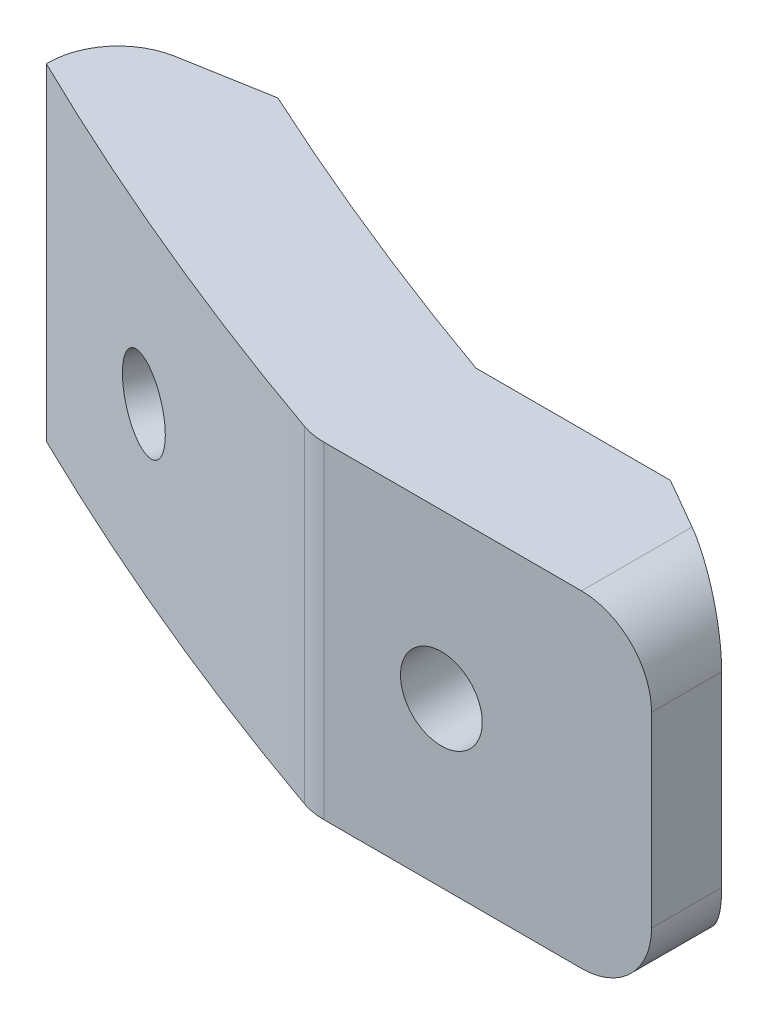
ISO-10303-21;
HEADER;
FILE_DESCRIPTION(('STEP AP214'),'2;1');
FILE_NAME('part.step','',(''),(''),'','','');
FILE_SCHEMA(('AUTOMOTIVE_DESIGN { 1 0 10303 214 1 1 1 1 }'));
ENDSEC;
DATA;
#1=APPLICATION_CONTEXT('core data for automotive mechanical design processes');
#2=APPLICATION_PROTOCOL_DEFINITION('international standard','automotive_design',2000,#1);
#3=PRODUCT_CONTEXT('',#1,'mechanical');
#4=PRODUCT('Part','Part','',(#3));
#5=PRODUCT_RELATED_PRODUCT_CATEGORY('part','',(#4));
#6=PRODUCT_DEFINITION_FORMATION('','',#4);
#7=PRODUCT_DEFINITION_CONTEXT('part definition',#1,'design');
#8=PRODUCT_DEFINITION('design','',#6,#7);
#9=PRODUCT_DEFINITION_SHAPE('','',#8);
#10=(LENGTH_UNIT() NAMED_UNIT(*) SI_UNIT(.MILLI.,.METRE.));
#11=(NAMED_UNIT(*) PLANE_ANGLE_UNIT() SI_UNIT($,.RADIAN.));
#12=(NAMED_UNIT(*) SI_UNIT($,.STERADIAN.) SOLID_ANGLE_UNIT());
#13=UNCERTAINTY_MEASURE_WITH_UNIT(LENGTH_MEASURE(1.E-05),#10,'distance_accuracy_value','');
#14=(GEOMETRIC_REPRESENTATION_CONTEXT(3) GLOBAL_UNCERTAINTY_ASSIGNED_CONTEXT((#13)) GLOBAL_UNIT_ASSIGNED_CONTEXT((#10,
#11,#12)) REPRESENTATION_CONTEXT('',''));
#15=CARTESIAN_POINT('',(0.,0.,0.));
#16=DIRECTION('',(0.,0.,1.));
#17=DIRECTION('',(1.,0.,0.));
#18=AXIS2_PLACEMENT_3D('',#15,#16,#17);
#19=CARTESIAN_POINT('',(-25.,7.,33.5));
#20=DIRECTION('',(1.,0.,0.));
#21=DIRECTION('',(0.,0.,-1.));
#22=AXIS2_PLACEMENT_3D('',#19,#20,#21);
#23=PLANE('',#22);
#24=DIRECTION('',(0.,0.,1.));
#25=VECTOR('',#24,1.);
#26=CARTESIAN_POINT('',(-25.,7.,33.5));
#27=LINE('',#26,#25);
#28=CARTESIAN_POINT('',(-25.,7.,25.3385305848672));
#29=VERTEX_POINT('',#28);
#30=CARTESIAN_POINT('',(-25.,7.,25.4123547212383));
#31=VERTEX_POINT('',#30);
#32=EDGE_CURVE('E441',#29,#31,#27,.T.);
#33=ORIENTED_EDGE('',*,*,#32,.F.);
#34=DIRECTION('',(0.,-1.,0.));
#35=VECTOR('',#34,1.);
#36=CARTESIAN_POINT('',(-25.,7.,25.3385305848672));
#37=LINE('',#36,#35);
#38=CARTESIAN_POINT('',(-25.,-7.,25.3385305848672));
#39=VERTEX_POINT('',#38);
#40=EDGE_CURVE('E461',#29,#39,#37,.T.);
#41=ORIENTED_EDGE('',*,*,#40,.T.);
#42=DIRECTION('',(0.,0.,1.));
#43=VECTOR('',#42,1.);
#44=CARTESIAN_POINT('',(-25.,-7.,33.5));
#45=LINE('',#44,#43);
#46=CARTESIAN_POINT('',(-25.,-7.,25.4123547212383));
#47=VERTEX_POINT('',#46);
#48=EDGE_CURVE('E449',#39,#47,#45,.T.);
#49=ORIENTED_EDGE('',*,*,#48,.T.);
#50=DIRECTION('',(0.,1.,0.));
#51=VECTOR('',#50,1.);
#52=CARTESIAN_POINT('',(-25.,-7.,25.4123547212383));
#53=LINE('',#52,#51);
#54=EDGE_CURVE('E426',#31,#47,#53,.F.);
#55=ORIENTED_EDGE('',*,*,#54,.F.);
#56=EDGE_LOOP('',(#33,#41,#49,#55));
#57=FACE_BOUND('',#56,.T.);
#58=ADVANCED_FACE('F38',(#57),#23,.F.);
#59=CARTESIAN_POINT('',(9.,7.,33.5));
#60=DIRECTION('',(0.,0.,-1.));
#61=DIRECTION('',(-1.,0.,0.));
#62=AXIS2_PLACEMENT_3D('',#59,#60,#61);
#63=PLANE('',#62);
#64=CARTESIAN_POINT('',(0.,0.,33.5));
#65=DIRECTION('',(0.,0.,1.));
#66=DIRECTION('',(1.,0.,0.));
#67=AXIS2_PLACEMENT_3D('',#64,#65,#66);
#68=CIRCLE('',#67,1.75);
#69=CARTESIAN_POINT('',(1.75,0.,33.5));
#70=VERTEX_POINT('',#69);
#71=EDGE_CURVE('E435',#70,#70,#68,.T.);
#72=ORIENTED_EDGE('',*,*,#71,.F.);
#73=EDGE_LOOP('',(#72));
#74=FACE_BOUND('',#73,.T.);
#75=DIRECTION('',(1.,0.,0.));
#76=VECTOR('',#75,1.);
#77=CARTESIAN_POINT('',(9.,-7.,33.5));
#78=LINE('',#77,#76);
#79=CARTESIAN_POINT('',(-5.03347213942744,-7.,33.5));
#80=VERTEX_POINT('',#79);
#81=CARTESIAN_POINT('',(6.,-7.,33.5));
#82=VERTEX_POINT('',#81);
#83=EDGE_CURVE('E451',#80,#82,#78,.T.);
#84=ORIENTED_EDGE('',*,*,#83,.T.);
#85=CARTESIAN_POINT('',(6.,-4.,33.5));
#86=DIRECTION('',(0.,0.,-1.));
#87=DIRECTION('',(-1.,0.,0.));
#88=AXIS2_PLACEMENT_3D('',#85,#86,#87);
#89=CIRCLE('',#88,3.);
#90=CARTESIAN_POINT('',(9.,-4.,33.5));
#91=VERTEX_POINT('',#90);
#92=EDGE_CURVE('E363',#82,#91,#89,.F.);
#93=ORIENTED_EDGE('',*,*,#92,.T.);
#94=DIRECTION('',(0.,-1.,0.));
#95=VECTOR('',#94,1.);
#96=CARTESIAN_POINT('',(9.,7.,33.5));
#97=LINE('',#96,#95);
#98=CARTESIAN_POINT('',(9.,4.,33.5));
#99=VERTEX_POINT('',#98);
#100=EDGE_CURVE('E458',#99,#91,#97,.T.);
#101=ORIENTED_EDGE('',*,*,#100,.F.);
#102=CARTESIAN_POINT('',(6.,4.,33.5));
#103=DIRECTION('',(0.,0.,-1.));
#104=DIRECTION('',(-1.,0.,0.));
#105=AXIS2_PLACEMENT_3D('',#102,#103,#104);
#106=CIRCLE('',#105,3.);
#107=CARTESIAN_POINT('',(6.,7.,33.5));
#108=VERTEX_POINT('',#107);
#109=EDGE_CURVE('E356',#99,#108,#106,.F.);
#110=ORIENTED_EDGE('',*,*,#109,.T.);
#111=DIRECTION('',(1.,0.,0.));
#112=VECTOR('',#111,1.);
#113=CARTESIAN_POINT('',(9.,7.,33.5));
#114=LINE('',#113,#112);
#115=CARTESIAN_POINT('',(-5.03347213942744,7.,33.5));
#116=VERTEX_POINT('',#115);
#117=EDGE_CURVE('E444',#116,#108,#114,.T.);
#118=ORIENTED_EDGE('',*,*,#117,.F.);
#119=DIRECTION('',(0.,-1.,0.));
#120=VECTOR('',#119,1.);
#121=CARTESIAN_POINT('',(-5.03347213942744,-7.,33.5));
#122=LINE('',#121,#120);
#123=EDGE_CURVE('E364',#116,#80,#122,.T.);
#124=ORIENTED_EDGE('',*,*,#123,.T.);
#125=EDGE_LOOP('',(#84,#93,#101,#110,#118,#124));
#126=FACE_BOUND('',#125,.T.);
#127=ADVANCED_FACE('F324',(#74,#126),#63,.F.);
#128=CARTESIAN_POINT('',(0.,7.,0.));
#129=DIRECTION('',(0.,1.,0.));
#130=DIRECTION('',(0.,0.,1.));
#131=AXIS2_PLACEMENT_3D('',#128,#129,#130);
#132=PLANE('',#131);
#133=CARTESIAN_POINT('',(51.,7.,-130.));
#134=DIRECTION('',(0.,1.,0.));
#135=DIRECTION('',(0.,0.,1.));
#136=AXIS2_PLACEMENT_3D('',#133,#134,#135);
#137=CIRCLE('',#136,167.);
#138=CARTESIAN_POINT('',(-18.7770704656511,7.,21.7239613153821));
#139=VERTEX_POINT('',#138);
#140=CARTESIAN_POINT('',(-4.52251795442995,7.,27.5));
#141=VERTEX_POINT('',#140);
#142=EDGE_CURVE('E219',#139,#141,#137,.T.);
#143=ORIENTED_EDGE('',*,*,#142,.F.);
#144=DIRECTION('',(-0.984807753012209,0.,0.173648177666924));
#145=VECTOR('',#144,1.);
#146=CARTESIAN_POINT('',(-25.,7.,22.8212316913353));
#147=LINE('',#146,#145);
#148=CARTESIAN_POINT('',(-22.5209445330008,7.,22.3841073258306));
#149=VERTEX_POINT('',#148);
#150=EDGE_CURVE('E439',#139,#149,#147,.T.);
#151=ORIENTED_EDGE('',*,*,#150,.T.);
#152=CARTESIAN_POINT('',(-22.,7.,25.3385305848672));
#153=DIRECTION('',(0.,1.,0.));
#154=DIRECTION('',(0.,0.,1.));
#155=AXIS2_PLACEMENT_3D('',#152,#153,#154);
#156=CIRCLE('',#155,3.);
#157=EDGE_CURVE('E477',#149,#29,#156,.T.);
#158=ORIENTED_EDGE('',*,*,#157,.T.);
#159=ORIENTED_EDGE('',*,*,#32,.T.);
#160=CARTESIAN_POINT('',(51.,7.,-130.));
#161=DIRECTION('',(0.,1.,0.));
#162=DIRECTION('',(0.,0.,1.));
#163=AXIS2_PLACEMENT_3D('',#160,#161,#162);
#164=CIRCLE('',#163,173.);
#165=CARTESIAN_POINT('',(-6.02229811835852,7.,33.3323529411765));
#166=VERTEX_POINT('',#165);
#167=EDGE_CURVE('E427',#31,#166,#164,.T.);
#168=ORIENTED_EDGE('',*,*,#167,.T.);
#169=CARTESIAN_POINT('',(-5.03347213942744,7.,30.5));
#170=DIRECTION('',(0.,1.,0.));
#171=DIRECTION('',(0.,0.,1.));
#172=AXIS2_PLACEMENT_3D('',#169,#170,#171);
#173=CIRCLE('',#172,3.);
#174=EDGE_CURVE('E474',#166,#116,#173,.T.);
#175=ORIENTED_EDGE('',*,*,#174,.T.);
#176=ORIENTED_EDGE('',*,*,#117,.T.);
#177=DIRECTION('',(0.,0.,-1.));
#178=VECTOR('',#177,1.);
#179=CARTESIAN_POINT('',(6.,7.,30.5));
#180=LINE('',#179,#178);
#181=CARTESIAN_POINT('',(6.,7.,28.7679491924311));
#182=VERTEX_POINT('',#181);
#183=EDGE_CURVE('E358',#108,#182,#180,.T.);
#184=ORIENTED_EDGE('',*,*,#183,.T.);
#185=DIRECTION('',(-0.866025403784441,0.,-0.499999999999996));
#186=VECTOR('',#185,1.);
#187=CARTESIAN_POINT('',(9.,7.,30.5));
#188=LINE('',#187,#186);
#189=CARTESIAN_POINT('',(3.80384757729328,7.,27.5));
#190=VERTEX_POINT('',#189);
#191=EDGE_CURVE('E229',#182,#190,#188,.T.);
#192=ORIENTED_EDGE('',*,*,#191,.T.);
#193=DIRECTION('',(1.,0.,0.));
#194=VECTOR('',#193,1.);
#195=CARTESIAN_POINT('',(-4.52251795442995,7.,27.5));
#196=LINE('',#195,#194);
#197=EDGE_CURVE('E209',#141,#190,#196,.T.);
#198=ORIENTED_EDGE('',*,*,#197,.F.);
#199=EDGE_LOOP('',(#143,#151,#158,#159,#168,#175,#176,#184,#192,#198));
#200=FACE_BOUND('',#199,.T.);
#201=ADVANCED_FACE('F226',(#200),#132,.T.);
#202=CARTESIAN_POINT('',(0.,-7.,0.));
#203=DIRECTION('',(0.,1.,0.));
#204=DIRECTION('',(0.,0.,1.));
#205=AXIS2_PLACEMENT_3D('',#202,#203,#204);
#206=PLANE('',#205);
#207=DIRECTION('',(-0.984807753012209,0.,0.173648177666924));
#208=VECTOR('',#207,1.);
#209=CARTESIAN_POINT('',(-25.,-7.,22.8212316913353));
#210=LINE('',#209,#208);
#211=CARTESIAN_POINT('',(-18.7770704656511,-7.,21.7239613153821));
#212=VERTEX_POINT('',#211);
#213=CARTESIAN_POINT('',(-22.5209445330008,-7.,22.3841073258306));
#214=VERTEX_POINT('',#213);
#215=EDGE_CURVE('E438',#212,#214,#210,.T.);
#216=ORIENTED_EDGE('',*,*,#215,.F.);
#217=CARTESIAN_POINT('',(51.,-7.,-130.));
#218=DIRECTION('',(0.,1.,0.));
#219=DIRECTION('',(0.,0.,1.));
#220=AXIS2_PLACEMENT_3D('',#217,#218,#219);
#221=CIRCLE('',#220,167.);
#222=CARTESIAN_POINT('',(-4.52251795442995,-7.,27.5));
#223=VERTEX_POINT('',#222);
#224=EDGE_CURVE('E752',#212,#223,#221,.T.);
#225=ORIENTED_EDGE('',*,*,#224,.T.);
#226=DIRECTION('',(1.,0.,0.));
#227=VECTOR('',#226,1.);
#228=CARTESIAN_POINT('',(0.,-7.,27.5));
#229=LINE('',#228,#227);
#230=CARTESIAN_POINT('',(3.8038475772933,-7.,27.5));
#231=VERTEX_POINT('',#230);
#232=EDGE_CURVE('E496',#223,#231,#229,.T.);
#233=ORIENTED_EDGE('',*,*,#232,.T.);
#234=DIRECTION('',(-0.866025403784441,0.,-0.499999999999996));
#235=VECTOR('',#234,1.);
#236=CARTESIAN_POINT('',(9.,-7.,30.5));
#237=LINE('',#236,#235);
#238=CARTESIAN_POINT('',(6.,-7.,28.7679491924311));
#239=VERTEX_POINT('',#238);
#240=EDGE_CURVE('E442',#239,#231,#237,.T.);
#241=ORIENTED_EDGE('',*,*,#240,.F.);
#242=DIRECTION('',(0.,0.,-1.));
#243=VECTOR('',#242,1.);
#244=CARTESIAN_POINT('',(6.,-7.,0.));
#245=LINE('',#244,#243);
#246=EDGE_CURVE('E466',#239,#82,#245,.F.);
#247=ORIENTED_EDGE('',*,*,#246,.T.);
#248=ORIENTED_EDGE('',*,*,#83,.F.);
#249=CARTESIAN_POINT('',(-5.03347213942744,-7.,30.5));
#250=DIRECTION('',(0.,1.,0.));
#251=DIRECTION('',(0.,0.,1.));
#252=AXIS2_PLACEMENT_3D('',#249,#250,#251);
#253=CIRCLE('',#252,3.);
#254=CARTESIAN_POINT('',(-6.02229811835852,-7.,33.3323529411765));
#255=VERTEX_POINT('',#254);
#256=EDGE_CURVE('E464',#80,#255,#253,.F.);
#257=ORIENTED_EDGE('',*,*,#256,.T.);
#258=CARTESIAN_POINT('',(51.,-7.,-130.));
#259=DIRECTION('',(0.,1.,0.));
#260=DIRECTION('',(0.,0.,1.));
#261=AXIS2_PLACEMENT_3D('',#258,#259,#260);
#262=CIRCLE('',#261,173.);
#263=EDGE_CURVE('E423',#47,#255,#262,.T.);
#264=ORIENTED_EDGE('',*,*,#263,.F.);
#265=ORIENTED_EDGE('',*,*,#48,.F.);
#266=CARTESIAN_POINT('',(-22.,-7.,25.3385305848672));
#267=DIRECTION('',(0.,1.,0.));
#268=DIRECTION('',(0.,0.,1.));
#269=AXIS2_PLACEMENT_3D('',#266,#267,#268);
#270=CIRCLE('',#269,3.);
#271=EDGE_CURVE('E468',#39,#214,#270,.F.);
#272=ORIENTED_EDGE('',*,*,#271,.T.);
#273=EDGE_LOOP('',(#216,#225,#233,#241,#247,#248,#257,#264,#265,#272));
#274=FACE_BOUND('',#273,.T.);
#275=ADVANCED_FACE('F493',(#274),#206,.F.);
#276=CARTESIAN_POINT('',(9.,7.,30.5));
#277=DIRECTION('',(-0.499999999999996,0.,0.866025403784441));
#278=DIRECTION('',(0.866025403784441,0.,0.499999999999996));
#279=AXIS2_PLACEMENT_3D('',#276,#277,#278);
#280=PLANE('',#279);
#281=ORIENTED_EDGE('',*,*,#240,.T.);
#282=DIRECTION('',(0.,-1.,0.));
#283=VECTOR('',#282,1.);
#284=CARTESIAN_POINT('',(3.80384757729331,7.,27.5));
#285=LINE('',#284,#283);
#286=EDGE_CURVE('E433',#190,#231,#285,.T.);
#287=ORIENTED_EDGE('',*,*,#286,.F.);
#288=ORIENTED_EDGE('',*,*,#191,.F.);
#289=CARTESIAN_POINT('',(6.,4.,28.7679491924311));
#290=DIRECTION('',(-0.499999999999996,0.,0.866025403784441));
#291=DIRECTION('',(0.866025403784441,0.,0.499999999999996));
#292=AXIS2_PLACEMENT_3D('',#289,#290,#291);
#293=ELLIPSE('',#292,3.46410161513775,3.);
#294=CARTESIAN_POINT('',(9.,4.,30.5));
#295=VERTEX_POINT('',#294);
#296=EDGE_CURVE('E483',#182,#295,#293,.F.);
#297=ORIENTED_EDGE('',*,*,#296,.T.);
#298=DIRECTION('',(0.,-1.,0.));
#299=VECTOR('',#298,1.);
#300=CARTESIAN_POINT('',(9.,7.,30.5));
#301=LINE('',#300,#299);
#302=CARTESIAN_POINT('',(9.,-4.,30.5));
#303=VERTEX_POINT('',#302);
#304=EDGE_CURVE('E447',#295,#303,#301,.T.);
#305=ORIENTED_EDGE('',*,*,#304,.T.);
#306=CARTESIAN_POINT('',(6.,-4.,28.7679491924311));
#307=DIRECTION('',(-0.499999999999996,0.,0.866025403784441));
#308=DIRECTION('',(-0.866025403784441,0.,-0.499999999999996));
#309=AXIS2_PLACEMENT_3D('',#306,#307,#308);
#310=ELLIPSE('',#309,3.46410161513775,3.);
#311=EDGE_CURVE('E368',#303,#239,#310,.F.);
#312=ORIENTED_EDGE('',*,*,#311,.T.);
#313=EDGE_LOOP('',(#281,#287,#288,#297,#305,#312));
#314=FACE_BOUND('',#313,.T.);
#315=ADVANCED_FACE('F486',(#314),#280,.F.);
#316=CARTESIAN_POINT('',(0.,0.,-1.5));
#317=DIRECTION('',(0.,0.,1.));
#318=DIRECTION('',(1.,0.,0.));
#319=AXIS2_PLACEMENT_3D('',#316,#317,#318);
#320=CYLINDRICAL_SURFACE('',#319,1.75);
#321=CARTESIAN_POINT('',(0.,0.,30.5));
#322=DIRECTION('',(0.,0.,1.));
#323=DIRECTION('',(1.,0.,0.));
#324=AXIS2_PLACEMENT_3D('',#321,#322,#323);
#325=CIRCLE('',#324,1.75);
#326=CARTESIAN_POINT('',(1.75,0.,30.5));
#327=VERTEX_POINT('',#326);
#328=EDGE_CURVE('E307',#327,#327,#325,.F.);
#329=ORIENTED_EDGE('',*,*,#328,.T.);
#330=EDGE_LOOP('',(#329));
#331=FACE_BOUND('',#330,.T.);
#332=ORIENTED_EDGE('',*,*,#71,.T.);
#333=EDGE_LOOP('',(#332));
#334=FACE_BOUND('',#333,.T.);
#335=ADVANCED_FACE('F338',(#331,#334),#320,.F.);
#336=CARTESIAN_POINT('',(-25.,7.,22.8212316913353));
#337=DIRECTION('',(0.173648177666924,0.,0.984807753012209));
#338=DIRECTION('',(0.984807753012209,0.,-0.173648177666924));
#339=AXIS2_PLACEMENT_3D('',#336,#337,#338);
#340=PLANE('',#339);
#341=ORIENTED_EDGE('',*,*,#150,.F.);
#342=DIRECTION('',(0.,1.,0.));
#343=VECTOR('',#342,1.);
#344=CARTESIAN_POINT('',(-18.7770704656511,-7.30276141803491,21.7239613153821));
#345=LINE('',#344,#343);
#346=EDGE_CURVE('E222',#139,#212,#345,.F.);
#347=ORIENTED_EDGE('',*,*,#346,.T.);
#348=ORIENTED_EDGE('',*,*,#215,.T.);
#349=DIRECTION('',(0.,-1.,0.));
#350=VECTOR('',#349,1.);
#351=CARTESIAN_POINT('',(-22.5209445330008,7.,22.3841073258306));
#352=LINE('',#351,#350);
#353=EDGE_CURVE('E471',#214,#149,#352,.F.);
#354=ORIENTED_EDGE('',*,*,#353,.T.);
#355=EDGE_LOOP('',(#341,#347,#348,#354));
#356=FACE_BOUND('',#355,.T.);
#357=ADVANCED_FACE('F335',(#356),#340,.F.);
#358=CARTESIAN_POINT('',(9.,7.,33.5));
#359=DIRECTION('',(-1.,0.,0.));
#360=DIRECTION('',(0.,0.,1.));
#361=AXIS2_PLACEMENT_3D('',#358,#359,#360);
#362=PLANE('',#361);
#363=ORIENTED_EDGE('',*,*,#100,.T.);
#364=DIRECTION('',(0.,0.,-1.));
#365=VECTOR('',#364,1.);
#366=CARTESIAN_POINT('',(9.,-4.,33.5));
#367=LINE('',#366,#365);
#368=EDGE_CURVE('E480',#91,#303,#367,.T.);
#369=ORIENTED_EDGE('',*,*,#368,.T.);
#370=ORIENTED_EDGE('',*,*,#304,.F.);
#371=DIRECTION('',(0.,0.,-1.));
#372=VECTOR('',#371,1.);
#373=CARTESIAN_POINT('',(9.,4.,33.5));
#374=LINE('',#373,#372);
#375=EDGE_CURVE('E357',#295,#99,#374,.F.);
#376=ORIENTED_EDGE('',*,*,#375,.T.);
#377=EDGE_LOOP('',(#363,#369,#370,#376));
#378=FACE_BOUND('',#377,.T.);
#379=ADVANCED_FACE('F321',(#378),#362,.F.);
#380=CARTESIAN_POINT('',(0.,0.,47.642135623731));
#381=DIRECTION('',(0.,0.,-1.));
#382=DIRECTION('',(-1.,0.,0.));
#383=AXIS2_PLACEMENT_3D('',#380,#381,#382);
#384=CYLINDRICAL_SURFACE('',#383,5.);
#385=CARTESIAN_POINT('',(-4.52251795442993,2.13233002883206,27.5));
#386=CARTESIAN_POINT('',(-4.5790055105326,2.01256202847707,27.4800859896038));
#387=CARTESIAN_POINT('',(-4.63081327318509,1.89030933910821,27.4617890907173));
#388=CARTESIAN_POINT('',(-4.7246789235139,1.6416541017985,27.4285955794175));
#389=CARTESIAN_POINT('',(-4.76673567873853,1.51525107379439,27.413699361952));
#390=CARTESIAN_POINT('',(-4.84065824249766,1.25927267616804,27.3874912681715));
#391=CARTESIAN_POINT('',(-4.8725343381264,1.1297006521534,27.3761757738055));
#392=CARTESIAN_POINT('',(-4.92585863954503,0.868171980339115,27.3572341585042));
#393=CARTESIAN_POINT('',(-4.94730762248902,0.736215511017627,27.349607762613));
#394=CARTESIAN_POINT('',(-4.97960122559821,0.470631938676572,27.3381217021893));
#395=CARTESIAN_POINT('',(-4.99042879795881,0.337002497421308,27.3342680931556));
#396=CARTESIAN_POINT('',(-5.00131571147383,0.0692506973415268,27.3303933509616));
#397=CARTESIAN_POINT('',(-5.00137496808953,-0.0648716653444985,27.330372247889));
#398=CARTESIAN_POINT('',(-4.99072376255767,-0.332573887966745,27.3341631257418));
#399=CARTESIAN_POINT('',(-4.98001861338566,-0.466153982892538,27.3379732157096));
#400=CARTESIAN_POINT('',(-4.94796557923136,-0.731815075425706,27.3493737726669));
#401=CARTESIAN_POINT('',(-4.92661965563462,-0.863896344720331,27.3569635429579));
#402=CARTESIAN_POINT('',(-4.86002614690025,-1.19184253864757,27.3806193063871));
#403=CARTESIAN_POINT('',(-4.80815271217737,-1.38625625937108,27.3990299529508));
#404=CARTESIAN_POINT('',(-4.71345750492359,-1.67134046520243,27.4325625373672));
#405=CARTESIAN_POINT('',(-4.67907873443091,-1.76527813332275,27.4447260003875));
#406=CARTESIAN_POINT('',(-4.60485566125709,-1.95070923668064,27.4709546911556));
#407=CARTESIAN_POINT('',(-4.56501076927618,-2.04220240710577,27.4850201239514));
#408=CARTESIAN_POINT('',(-4.52251795442999,-2.13233002883193,27.5));
#409=B_SPLINE_CURVE_WITH_KNOTS('',3,(#385,#386,#387,#388,#389,#390,#391,#392,#393,#394,#395,
#396,#397,#398,#399,#400,#401,#402,#403,#404,#405,#406,#407,#408),.UNSPECIFIED.,.F.,.F.,(4,2,2,
2,2,2,2,2,2,2,2,4),(0.,0.401627317238899,0.803301254888277,1.20456802566057,1.60580488461083,
2.00768469676117,2.4095676639462,2.81125237152819,3.21286306500345,3.81715973212642,
4.11930137033656,4.42147560791891),.UNSPECIFIED.);
#410=CARTESIAN_POINT('',(-4.52251795442995,2.13233002883214,27.5));
#411=VERTEX_POINT('',#410);
#412=CARTESIAN_POINT('',(-4.52251795442995,-2.13233002883214,27.5));
#413=VERTEX_POINT('',#412);
#414=EDGE_CURVE('E245',#411,#413,#409,.T.);
#415=ORIENTED_EDGE('',*,*,#414,.F.);
#416=CARTESIAN_POINT('',(0.,0.,27.5));
#417=DIRECTION('',(0.,0.,-1.));
#418=DIRECTION('',(-1.,0.,0.));
#419=AXIS2_PLACEMENT_3D('',#416,#417,#418);
#420=CIRCLE('',#419,5.);
#421=EDGE_CURVE('E213',#413,#411,#420,.T.);
#422=ORIENTED_EDGE('',*,*,#421,.F.);
#423=EDGE_LOOP('',(#415,#422));
#424=FACE_BOUND('',#423,.T.);
#425=ADVANCED_FACE('F254',(#424),#384,.F.);
#426=CARTESIAN_POINT('',(9.,7.,27.5));
#427=DIRECTION('',(0.,0.,-1.));
#428=DIRECTION('',(-1.,0.,0.));
#429=AXIS2_PLACEMENT_3D('',#426,#427,#428);
#430=PLANE('',#429);
#431=ORIENTED_EDGE('',*,*,#421,.T.);
#432=DIRECTION('',(0.,1.,0.));
#433=VECTOR('',#432,1.);
#434=CARTESIAN_POINT('',(-4.52251795442995,-7.30276141803491,27.5));
#435=LINE('',#434,#433);
#436=EDGE_CURVE('E204',#411,#141,#435,.T.);
#437=ORIENTED_EDGE('',*,*,#436,.T.);
#438=ORIENTED_EDGE('',*,*,#197,.T.);
#439=ORIENTED_EDGE('',*,*,#286,.T.);
#440=ORIENTED_EDGE('',*,*,#232,.F.);
#441=EDGE_CURVE('E216',#223,#413,#435,.T.);
#442=ORIENTED_EDGE('',*,*,#441,.T.);
#443=EDGE_LOOP('',(#431,#437,#438,#439,#440,#442));
#444=FACE_BOUND('',#443,.T.);
#445=DIRECTION('',(0.866025403784439,-0.5,0.));
#446=VECTOR('',#445,1.);
#447=CARTESIAN_POINT('',(5.09391108675446,0.234455543377234,27.5));
#448=LINE('',#447,#446);
#449=CARTESIAN_POINT('',(0.,3.17542648054294,27.5));
#450=VERTEX_POINT('',#449);
#451=CARTESIAN_POINT('',(2.75,1.58771324027147,27.5));
#452=VERTEX_POINT('',#451);
#453=EDGE_CURVE('E46',#450,#452,#448,.T.);
#454=ORIENTED_EDGE('',*,*,#453,.F.);
#455=DIRECTION('',(0.866025403784439,0.5,0.));
#456=VECTOR('',#455,1.);
#457=CARTESIAN_POINT('',(8.40608891324554,8.02868417743717,27.5));
#458=LINE('',#457,#456);
#459=CARTESIAN_POINT('',(-2.75,1.58771324027147,27.5));
#460=VERTEX_POINT('',#459);
#461=EDGE_CURVE('E374',#460,#450,#458,.T.);
#462=ORIENTED_EDGE('',*,*,#461,.F.);
#463=DIRECTION('',(0.,1.,0.));
#464=VECTOR('',#463,1.);
#465=CARTESIAN_POINT('',(-2.75,7.,27.5));
#466=LINE('',#465,#464);
#467=CARTESIAN_POINT('',(-2.75,-1.58771324027147,27.5));
#468=VERTEX_POINT('',#467);
#469=EDGE_CURVE('E376',#468,#460,#466,.T.);
#470=ORIENTED_EDGE('',*,*,#469,.F.);
#471=DIRECTION('',(-0.866025403784439,0.5,0.));
#472=VECTOR('',#471,1.);
#473=CARTESIAN_POINT('',(2.34391108675446,-4.52868417743718,27.5));
#474=LINE('',#473,#472);
#475=CARTESIAN_POINT('',(0.,-3.17542648054294,27.5));
#476=VERTEX_POINT('',#475);
#477=EDGE_CURVE('E378',#476,#468,#474,.T.);
#478=ORIENTED_EDGE('',*,*,#477,.F.);
#479=DIRECTION('',(-0.866025403784439,-0.5,0.));
#480=VECTOR('',#479,1.);
#481=CARTESIAN_POINT('',(11.1560889132455,3.26554445662276,27.5));
#482=LINE('',#481,#480);
#483=CARTESIAN_POINT('',(2.75,-1.58771324027147,27.5));
#484=VERTEX_POINT('',#483);
#485=EDGE_CURVE('E380',#484,#476,#482,.T.);
#486=ORIENTED_EDGE('',*,*,#485,.F.);
#487=DIRECTION('',(0.,-1.,0.));
#488=VECTOR('',#487,1.);
#489=CARTESIAN_POINT('',(2.75,7.,27.5));
#490=LINE('',#489,#488);
#491=EDGE_CURVE('E382',#452,#484,#490,.T.);
#492=ORIENTED_EDGE('',*,*,#491,.F.);
#493=EDGE_LOOP('',(#454,#462,#470,#478,#486,#492));
#494=FACE_BOUND('',#493,.T.);
#495=ADVANCED_FACE('F206',(#444,#494),#430,.T.);
#496=CARTESIAN_POINT('',(51.,-7.,-130.));
#497=DIRECTION('',(0.,1.,0.));
#498=DIRECTION('',(0.,0.,1.));
#499=AXIS2_PLACEMENT_3D('',#496,#497,#498);
#500=CYLINDRICAL_SURFACE('',#499,173.);
#501=CARTESIAN_POINT('',(-15.6916009100873,0.,29.6284134108011));
#502=CARTESIAN_POINT('',(-15.6916049594718,0.0982919995005547,29.6284118009107));
#503=CARTESIAN_POINT('',(-15.6992683748225,0.196655202939389,29.6252106695407));
#504=CARTESIAN_POINT('',(-15.7297301975981,0.390672533537158,29.6124787407593));
#505=CARTESIAN_POINT('',(-15.7525468053098,0.486323258549211,29.6029403317269));
#506=CARTESIAN_POINT('',(-15.8126573885421,0.672076813793988,29.5777862616251));
#507=CARTESIAN_POINT('',(-15.8499444498084,0.762182269873077,29.5621735029849));
#508=CARTESIAN_POINT('',(-15.9379155612648,0.934302508289674,29.5252886663461));
#509=CARTESIAN_POINT('',(-15.9885962821513,1.01631929430546,29.504017994744));
#510=CARTESIAN_POINT('',(-16.1019113634131,1.16997262574894,29.4563804238563));
#511=CARTESIAN_POINT('',(-16.1645470988897,1.24160797540377,29.4300129383156));
#512=CARTESIAN_POINT('',(-16.2999762509462,1.37245607987086,29.372891628613));
#513=CARTESIAN_POINT('',(-16.3727700664706,1.43166834655492,29.342137632176));
#514=CARTESIAN_POINT('',(-16.5264338068573,1.53598948776939,29.2770783519536));
#515=CARTESIAN_POINT('',(-16.6073040538765,1.58109779941714,29.2427729265049));
#516=CARTESIAN_POINT('',(-16.7748086196898,1.65592906174308,29.1715539622889));
#517=CARTESIAN_POINT('',(-16.861442930733,1.68565203310928,29.1346404270287));
#518=CARTESIAN_POINT('',(-17.0380206538802,1.72887462453696,29.0592246888987));
#519=CARTESIAN_POINT('',(-17.1279645625751,1.74237179967275,29.0207222475142));
#520=CARTESIAN_POINT('',(-17.3085918958139,1.75275377523122,28.9432160564653));
#521=CARTESIAN_POINT('',(-17.3992753200665,1.74963858219738,28.9042123069985));
#522=CARTESIAN_POINT('',(-17.5788307078942,1.7268833844698,28.8268035995296));
#523=CARTESIAN_POINT('',(-17.6677022540914,1.70723961539414,28.7883987799635));
#524=CARTESIAN_POINT('',(-17.8410974569528,1.65198061779479,28.7133020060781));
#525=CARTESIAN_POINT('',(-17.9256211030173,1.61636535033654,28.6766100559347));
#526=CARTESIAN_POINT('',(-18.0879468259452,1.53016637747384,28.6060006675667));
#527=CARTESIAN_POINT('',(-18.1657477728969,1.4795801621382,28.572083695795));
#528=CARTESIAN_POINT('',(-18.3124176247325,1.36487605101589,28.5080287491701));
#529=CARTESIAN_POINT('',(-18.3812865335355,1.30075816116631,28.4778907726588));
#530=CARTESIAN_POINT('',(-18.5081464041777,1.16081496652962,28.4222913324301));
#531=CARTESIAN_POINT('',(-18.5661382878462,1.08499065485701,28.3968294724151));
#532=CARTESIAN_POINT('',(-18.669618202854,0.92378179009664,28.3513419737233));
#533=CARTESIAN_POINT('',(-18.7151062579465,0.838397255170514,28.3313163247196));
#534=CARTESIAN_POINT('',(-18.7922831221038,0.660525761649543,28.2973120530006));
#535=CARTESIAN_POINT('',(-18.8239771221125,0.568041490249422,28.2833311555528));
#536=CARTESIAN_POINT('',(-18.8726987679277,0.378568520459816,28.2618295171178));
#537=CARTESIAN_POINT('',(-18.8897264547936,0.281579834681603,28.2543087580448));
#538=CARTESIAN_POINT('',(-18.9086321360596,0.0858961572990958,28.2459581222552));
#539=CARTESIAN_POINT('',(-18.9105166745074,-0.0127980787780785,28.245125355351));
#540=CARTESIAN_POINT('',(-18.8991002840799,-0.209131121780053,28.2501684578556));
#541=CARTESIAN_POINT('',(-18.8857993739043,-0.306769930004386,28.2560443190032));
#542=CARTESIAN_POINT('',(-18.8443893174023,-0.498205928758598,28.2743244740928));
#543=CARTESIAN_POINT('',(-18.8162823394224,-0.592003679643579,28.2867278120864));
#544=CARTESIAN_POINT('',(-18.746051681118,-0.773112078529585,28.3176861223241));
#545=CARTESIAN_POINT('',(-18.7039279856387,-0.860422719516612,28.3362411012194));
#546=CARTESIAN_POINT('',(-18.6068350760024,-1.02610387141579,28.3789484542832));
#547=CARTESIAN_POINT('',(-18.5518624982404,-1.1044720333403,28.4031022941185));
#548=CARTESIAN_POINT('',(-18.4306235649881,-1.25002137169211,28.4562806625685));
#549=CARTESIAN_POINT('',(-18.3643571759075,-1.31720251484561,28.4853052056697));
#550=CARTESIAN_POINT('',(-18.2223624046553,-1.43850274441335,28.54737632084));
#551=CARTESIAN_POINT('',(-18.1466297526007,-1.49261590383986,28.5804247077415));
#552=CARTESIAN_POINT('',(-17.9878602455578,-1.58620725802003,28.6495591729628));
#553=CARTESIAN_POINT('',(-17.9048233845152,-1.62568544064296,28.6856452538005));
#554=CARTESIAN_POINT('',(-17.7337630190631,-1.68889708137362,28.7598138928395));
#555=CARTESIAN_POINT('',(-17.6457380258094,-1.71262581147493,28.797897046866));
#556=CARTESIAN_POINT('',(-17.4672146017178,-1.74364538097633,28.8749507411717));
#557=CARTESIAN_POINT('',(-17.3767161660281,-1.75093618812997,28.9139212831916));
#558=CARTESIAN_POINT('',(-17.1958134589247,-1.74887126004817,28.9916372587147));
#559=CARTESIAN_POINT('',(-17.1054091866614,-1.73951567633481,29.0303826942638));
#560=CARTESIAN_POINT('',(-16.9272643314516,-1.70442174436111,29.1065559587553));
#561=CARTESIAN_POINT('',(-16.8395237510905,-1.67868338019912,29.1439837864188));
#562=CARTESIAN_POINT('',(-16.6692235108622,-1.61155924667065,29.2164713827081));
#563=CARTESIAN_POINT('',(-16.5866628790806,-1.57017642297528,29.2515315956648));
#564=CARTESIAN_POINT('',(-16.4290656231125,-1.4729380978132,29.3183242554917));
#565=CARTESIAN_POINT('',(-16.3540286954633,-1.41708318039332,29.350056836582));
#566=CARTESIAN_POINT('',(-16.2136448073115,-1.29250575886369,29.4093214537577));
#567=CARTESIAN_POINT('',(-16.1482947917131,-1.2237873272369,29.4368548142892));
#568=CARTESIAN_POINT('',(-16.0291133464652,-1.07539936106193,29.4869968263932));
#569=CARTESIAN_POINT('',(-15.9752847736706,-0.995727118433368,29.509604256558));
#570=CARTESIAN_POINT('',(-15.8806959874277,-0.827689565370017,29.549287508726));
#571=CARTESIAN_POINT('',(-15.8399404719882,-0.739321144701557,29.566361342167));
#572=CARTESIAN_POINT('',(-15.7727319374854,-0.55648916689009,29.5944974291544));
#573=CARTESIAN_POINT('',(-15.7462617833414,-0.462033064825825,29.605566884945));
#574=CARTESIAN_POINT('',(-15.7154348293966,-0.305813029211675,29.6184541592898));
#575=CARTESIAN_POINT('',(-15.7065083874476,-0.245064005571011,29.622184489454));
#576=CARTESIAN_POINT('',(-15.6945901618926,-0.122885933322878,29.6271646184857));
#577=CARTESIAN_POINT('',(-15.6915983782174,-0.0614568847233385,29.628414417382));
#578=CARTESIAN_POINT('',(-15.6916009100873,0.,29.6284134108011));
#579=B_SPLINE_CURVE_WITH_KNOTS('',3,(#501,#502,#503,#504,#505,#506,#507,#508,#509,#510,#511,
#512,#513,#514,#515,#516,#517,#518,#519,#520,#521,#522,#523,#524,#525,#526,#527,#528,#529,#530,
#531,#532,#533,#534,#535,#536,#537,#538,#539,#540,#541,#542,#543,#544,#545,#546,#547,#548,#549,
#550,#551,#552,#553,#554,#555,#556,#557,#558,#559,#560,#561,#562,#563,#564,#565,#566,#567,#568,
#569,#570,#571,#572,#573,#574,#575,#576,#577,#578),.UNSPECIFIED.,.T.,.F.,(4,2,2,2,2,2,2,2,2,2,2,
2,2,2,2,2,2,2,2,2,2,2,2,2,2,2,2,2,2,2,2,2,2,2,2,2,2,2,4),(0.,0.294651686279659,
0.589657916158262,0.88452335973558,1.17931557652338,1.47414172164512,1.76897944891758,
2.06382894153284,2.35867803767531,2.65357155652579,2.94846495921992,3.24342554204837,
3.53838684392153,3.83339762511798,4.128408276877,4.42339391514035,4.71837899302677,
5.0132529666871,5.30812611482127,5.60287182791252,5.89761717804646,6.19231937475868,
6.48702189010442,6.78180163981741,7.07658226628462,7.37149634054151,7.66641065924831,
7.96141347162784,8.25641686271699,8.55141756858155,8.84641856078368,9.14136403534746,
9.43629760872092,9.73113796598448,10.0260513473298,10.321070592012,10.6157351744676,
10.7999655799977,10.9841959833799),.UNSPECIFIED.);
#580=CARTESIAN_POINT('',(-15.6916009100873,0.,29.6284134108011));
#581=VERTEX_POINT('',#580);
#582=EDGE_CURVE('E298',#581,#581,#579,.T.);
#583=ORIENTED_EDGE('',*,*,#582,.F.);
#584=EDGE_LOOP('',(#583));
#585=FACE_BOUND('',#584,.T.);
#586=ORIENTED_EDGE('',*,*,#263,.T.);
#587=DIRECTION('',(0.,1.,0.));
#588=VECTOR('',#587,1.);
#589=CARTESIAN_POINT('',(-6.02229811835853,-7.,33.3323529411765));
#590=LINE('',#589,#588);
#591=EDGE_CURVE('E366',#255,#166,#590,.T.);
#592=ORIENTED_EDGE('',*,*,#591,.T.);
#593=ORIENTED_EDGE('',*,*,#167,.F.);
#594=ORIENTED_EDGE('',*,*,#54,.T.);
#595=EDGE_LOOP('',(#586,#592,#593,#594));
#596=FACE_BOUND('',#595,.T.);
#597=ADVANCED_FACE('F309',(#585,#596),#500,.T.);
#598=CARTESIAN_POINT('',(-22.,7.,25.3385305848672));
#599=DIRECTION('',(0.,-1.,0.));
#600=DIRECTION('',(0.,0.,-1.));
#601=AXIS2_PLACEMENT_3D('',#598,#599,#600);
#602=CYLINDRICAL_SURFACE('',#601,3.);
#603=ORIENTED_EDGE('',*,*,#157,.F.);
#604=ORIENTED_EDGE('',*,*,#353,.F.);
#605=ORIENTED_EDGE('',*,*,#271,.F.);
#606=ORIENTED_EDGE('',*,*,#40,.F.);
#607=EDGE_LOOP('',(#603,#604,#605,#606));
#608=FACE_BOUND('',#607,.T.);
#609=ADVANCED_FACE('F313',(#608),#602,.T.);
#610=CARTESIAN_POINT('',(6.,-4.,33.5));
#611=DIRECTION('',(0.,0.,-1.));
#612=DIRECTION('',(-1.,0.,0.));
#613=AXIS2_PLACEMENT_3D('',#610,#611,#612);
#614=CYLINDRICAL_SURFACE('',#613,3.);
#615=ORIENTED_EDGE('',*,*,#92,.F.);
#616=ORIENTED_EDGE('',*,*,#246,.F.);
#617=ORIENTED_EDGE('',*,*,#311,.F.);
#618=ORIENTED_EDGE('',*,*,#368,.F.);
#619=EDGE_LOOP('',(#615,#616,#617,#618));
#620=FACE_BOUND('',#619,.T.);
#621=ADVANCED_FACE('F342',(#620),#614,.T.);
#622=CARTESIAN_POINT('',(6.,4.,0.));
#623=DIRECTION('',(0.,0.,1.));
#624=DIRECTION('',(1.,0.,0.));
#625=AXIS2_PLACEMENT_3D('',#622,#623,#624);
#626=CYLINDRICAL_SURFACE('',#625,3.);
#627=ORIENTED_EDGE('',*,*,#109,.F.);
#628=ORIENTED_EDGE('',*,*,#375,.F.);
#629=ORIENTED_EDGE('',*,*,#296,.F.);
#630=ORIENTED_EDGE('',*,*,#183,.F.);
#631=EDGE_LOOP('',(#627,#628,#629,#630));
#632=FACE_BOUND('',#631,.T.);
#633=ADVANCED_FACE('F345',(#632),#626,.T.);
#634=CARTESIAN_POINT('',(-5.03347213942744,-7.,30.5));
#635=DIRECTION('',(0.,1.,0.));
#636=DIRECTION('',(0.,0.,1.));
#637=AXIS2_PLACEMENT_3D('',#634,#635,#636);
#638=CYLINDRICAL_SURFACE('',#637,3.);
#639=ORIENTED_EDGE('',*,*,#256,.F.);
#640=ORIENTED_EDGE('',*,*,#123,.F.);
#641=ORIENTED_EDGE('',*,*,#174,.F.);
#642=ORIENTED_EDGE('',*,*,#591,.F.);
#643=EDGE_LOOP('',(#639,#640,#641,#642));
#644=FACE_BOUND('',#643,.T.);
#645=ADVANCED_FACE('F40',(#644),#638,.T.);
#646=CARTESIAN_POINT('',(0.,0.,30.5));
#647=DIRECTION('',(0.,0.,1.));
#648=DIRECTION('',(1.,0.,0.));
#649=AXIS2_PLACEMENT_3D('',#646,#647,#648);
#650=PLANE('',#649);
#651=DIRECTION('',(-0.866025403784439,0.5,0.));
#652=VECTOR('',#651,1.);
#653=CARTESIAN_POINT('',(2.75,1.58771324027147,30.5));
#654=LINE('',#653,#652);
#655=CARTESIAN_POINT('',(2.75,1.58771324027147,30.5));
#656=VERTEX_POINT('',#655);
#657=CARTESIAN_POINT('',(0.,3.17542648054294,30.5));
#658=VERTEX_POINT('',#657);
#659=EDGE_CURVE('E305',#656,#658,#654,.T.);
#660=ORIENTED_EDGE('',*,*,#659,.F.);
#661=DIRECTION('',(0.,1.,0.));
#662=VECTOR('',#661,1.);
#663=CARTESIAN_POINT('',(2.75,-1.58771324027147,30.5));
#664=LINE('',#663,#662);
#665=CARTESIAN_POINT('',(2.75,-1.58771324027147,30.5));
#666=VERTEX_POINT('',#665);
#667=EDGE_CURVE('E398',#666,#656,#664,.T.);
#668=ORIENTED_EDGE('',*,*,#667,.F.);
#669=DIRECTION('',(0.866025403784439,0.5,0.));
#670=VECTOR('',#669,1.);
#671=CARTESIAN_POINT('',(0.,-3.17542648054294,30.5));
#672=LINE('',#671,#670);
#673=CARTESIAN_POINT('',(0.,-3.17542648054294,30.5));
#674=VERTEX_POINT('',#673);
#675=EDGE_CURVE('E535',#674,#666,#672,.T.);
#676=ORIENTED_EDGE('',*,*,#675,.F.);
#677=DIRECTION('',(0.866025403784439,-0.5,0.));
#678=VECTOR('',#677,1.);
#679=CARTESIAN_POINT('',(-2.75,-1.58771324027147,30.5));
#680=LINE('',#679,#678);
#681=CARTESIAN_POINT('',(-2.75,-1.58771324027147,30.5));
#682=VERTEX_POINT('',#681);
#683=EDGE_CURVE('E415',#682,#674,#680,.T.);
#684=ORIENTED_EDGE('',*,*,#683,.F.);
#685=DIRECTION('',(0.,-1.,0.));
#686=VECTOR('',#685,1.);
#687=CARTESIAN_POINT('',(-2.75,1.58771324027147,30.5));
#688=LINE('',#687,#686);
#689=CARTESIAN_POINT('',(-2.75,1.58771324027147,30.5));
#690=VERTEX_POINT('',#689);
#691=EDGE_CURVE('E526',#690,#682,#688,.T.);
#692=ORIENTED_EDGE('',*,*,#691,.F.);
#693=DIRECTION('',(-0.866025403784439,-0.5,0.));
#694=VECTOR('',#693,1.);
#695=CARTESIAN_POINT('',(0.,3.17542648054294,30.5));
#696=LINE('',#695,#694);
#697=EDGE_CURVE('E524',#658,#690,#696,.T.);
#698=ORIENTED_EDGE('',*,*,#697,.F.);
#699=EDGE_LOOP('',(#660,#668,#676,#684,#692,#698));
#700=FACE_BOUND('',#699,.T.);
#701=ORIENTED_EDGE('',*,*,#328,.F.);
#702=EDGE_LOOP('',(#701));
#703=FACE_BOUND('',#702,.T.);
#704=ADVANCED_FACE('F295',(#700,#703),#650,.F.);
#705=CARTESIAN_POINT('',(2.75,1.58771324027147,20.5));
#706=DIRECTION('',(0.5,0.866025403784439,0.));
#707=DIRECTION('',(-0.866025403784439,0.5,0.));
#708=AXIS2_PLACEMENT_3D('',#705,#706,#707);
#709=PLANE('',#708);
#710=ORIENTED_EDGE('',*,*,#453,.T.);
#711=DIRECTION('',(0.,0.,1.));
#712=VECTOR('',#711,1.);
#713=CARTESIAN_POINT('',(2.75,1.58771324027147,20.5));
#714=LINE('',#713,#712);
#715=EDGE_CURVE('E388',#452,#656,#714,.T.);
#716=ORIENTED_EDGE('',*,*,#715,.T.);
#717=ORIENTED_EDGE('',*,*,#659,.T.);
#718=DIRECTION('',(0.,0.,1.));
#719=VECTOR('',#718,1.);
#720=CARTESIAN_POINT('',(0.,3.17542648054294,20.5));
#721=LINE('',#720,#719);
#722=EDGE_CURVE('E390',#450,#658,#721,.T.);
#723=ORIENTED_EDGE('',*,*,#722,.F.);
#724=EDGE_LOOP('',(#710,#716,#717,#723));
#725=FACE_BOUND('',#724,.T.);
#726=ADVANCED_FACE('F315',(#725),#709,.F.);
#727=CARTESIAN_POINT('',(2.75,-1.58771324027147,20.5));
#728=DIRECTION('',(1.,0.,0.));
#729=DIRECTION('',(0.,0.,-1.));
#730=AXIS2_PLACEMENT_3D('',#727,#728,#729);
#731=PLANE('',#730);
#732=ORIENTED_EDGE('',*,*,#491,.T.);
#733=DIRECTION('',(0.,0.,1.));
#734=VECTOR('',#733,1.);
#735=CARTESIAN_POINT('',(2.75,-1.58771324027147,20.5));
#736=LINE('',#735,#734);
#737=EDGE_CURVE('E399',#484,#666,#736,.T.);
#738=ORIENTED_EDGE('',*,*,#737,.T.);
#739=ORIENTED_EDGE('',*,*,#667,.T.);
#740=ORIENTED_EDGE('',*,*,#715,.F.);
#741=EDGE_LOOP('',(#732,#738,#739,#740));
#742=FACE_BOUND('',#741,.T.);
#743=ADVANCED_FACE('F395',(#742),#731,.F.);
#744=CARTESIAN_POINT('',(0.,-3.17542648054294,20.5));
#745=DIRECTION('',(0.5,-0.866025403784439,0.));
#746=DIRECTION('',(0.866025403784439,0.5,0.));
#747=AXIS2_PLACEMENT_3D('',#744,#745,#746);
#748=PLANE('',#747);
#749=ORIENTED_EDGE('',*,*,#485,.T.);
#750=DIRECTION('',(0.,0.,1.));
#751=VECTOR('',#750,1.);
#752=CARTESIAN_POINT('',(0.,-3.17542648054294,20.5));
#753=LINE('',#752,#751);
#754=EDGE_CURVE('E408',#476,#674,#753,.T.);
#755=ORIENTED_EDGE('',*,*,#754,.T.);
#756=ORIENTED_EDGE('',*,*,#675,.T.);
#757=ORIENTED_EDGE('',*,*,#737,.F.);
#758=EDGE_LOOP('',(#749,#755,#756,#757));
#759=FACE_BOUND('',#758,.T.);
#760=ADVANCED_FACE('F406',(#759),#748,.F.);
#761=CARTESIAN_POINT('',(-2.75,-1.58771324027147,20.5));
#762=DIRECTION('',(-0.5,-0.866025403784439,0.));
#763=DIRECTION('',(0.866025403784439,-0.5,0.));
#764=AXIS2_PLACEMENT_3D('',#761,#762,#763);
#765=PLANE('',#764);
#766=ORIENTED_EDGE('',*,*,#477,.T.);
#767=DIRECTION('',(0.,0.,1.));
#768=VECTOR('',#767,1.);
#769=CARTESIAN_POINT('',(-2.75,-1.58771324027147,20.5));
#770=LINE('',#769,#768);
#771=EDGE_CURVE('E416',#468,#682,#770,.T.);
#772=ORIENTED_EDGE('',*,*,#771,.T.);
#773=ORIENTED_EDGE('',*,*,#683,.T.);
#774=ORIENTED_EDGE('',*,*,#754,.F.);
#775=EDGE_LOOP('',(#766,#772,#773,#774));
#776=FACE_BOUND('',#775,.T.);
#777=ADVANCED_FACE('F412',(#776),#765,.F.);
#778=CARTESIAN_POINT('',(-2.75,1.58771324027147,20.5));
#779=DIRECTION('',(-1.,0.,0.));
#780=DIRECTION('',(0.,-1.,0.));
#781=AXIS2_PLACEMENT_3D('',#778,#779,#780);
#782=PLANE('',#781);
#783=ORIENTED_EDGE('',*,*,#469,.T.);
#784=DIRECTION('',(0.,0.,1.));
#785=VECTOR('',#784,1.);
#786=CARTESIAN_POINT('',(-2.75,1.58771324027147,20.5));
#787=LINE('',#786,#785);
#788=EDGE_CURVE('E60',#460,#690,#787,.T.);
#789=ORIENTED_EDGE('',*,*,#788,.T.);
#790=ORIENTED_EDGE('',*,*,#691,.T.);
#791=ORIENTED_EDGE('',*,*,#771,.F.);
#792=EDGE_LOOP('',(#783,#789,#790,#791));
#793=FACE_BOUND('',#792,.T.);
#794=ADVANCED_FACE('F538',(#793),#782,.F.);
#795=CARTESIAN_POINT('',(0.,3.17542648054294,20.5));
#796=DIRECTION('',(-0.5,0.866025403784439,0.));
#797=DIRECTION('',(-0.866025403784439,-0.5,0.));
#798=AXIS2_PLACEMENT_3D('',#795,#796,#797);
#799=PLANE('',#798);
#800=ORIENTED_EDGE('',*,*,#461,.T.);
#801=ORIENTED_EDGE('',*,*,#722,.T.);
#802=ORIENTED_EDGE('',*,*,#697,.T.);
#803=ORIENTED_EDGE('',*,*,#788,.F.);
#804=EDGE_LOOP('',(#800,#801,#802,#803));
#805=FACE_BOUND('',#804,.T.);
#806=ADVANCED_FACE('F293',(#805),#799,.F.);
#807=CARTESIAN_POINT('',(-11.6995686322621,0.,15.0762192670729));
#808=DIRECTION('',(-0.37460659341591,0.,0.927183854566788));
#809=DIRECTION('',(0.927183854566788,0.,0.37460659341591));
#810=AXIS2_PLACEMENT_3D('',#807,#808,#809);
#811=CYLINDRICAL_SURFACE('',#810,1.75);
#812=CARTESIAN_POINT('',(-16.1948477532531,0.,26.2024255218744));
#813=DIRECTION('',(-0.37460659341591,0.,0.927183854566788));
#814=DIRECTION('',(0.927183854566788,0.,0.37460659341591));
#815=AXIS2_PLACEMENT_3D('',#812,#813,#814);
#816=CIRCLE('',#815,1.75);
#817=CARTESIAN_POINT('',(-14.5722760077612,0.,26.8579870603522));
#818=VERTEX_POINT('',#817);
#819=EDGE_CURVE('E306',#818,#818,#816,.F.);
#820=ORIENTED_EDGE('',*,*,#819,.T.);
#821=EDGE_LOOP('',(#820));
#822=FACE_BOUND('',#821,.T.);
#823=ORIENTED_EDGE('',*,*,#582,.T.);
#824=EDGE_LOOP('',(#823));
#825=FACE_BOUND('',#824,.T.);
#826=ADVANCED_FACE('F266',(#822,#825),#811,.F.);
#827=CARTESIAN_POINT('',(-11.3734917095058,0.,28.1503798076371));
#828=DIRECTION('',(-0.37460659341591,0.,0.927183854566788));
#829=DIRECTION('',(0.927183854566788,0.,0.37460659341591));
#830=AXIS2_PLACEMENT_3D('',#827,#828,#829);
#831=PLANE('',#830);
#832=DIRECTION('',(-0.802964772033615,-0.500000000000001,-0.324418826323326));
#833=VECTOR('',#832,1.);
#834=CARTESIAN_POINT('',(-16.1948477532531,3.17542648054294,26.2024255218744));
#835=LINE('',#834,#833);
#836=CARTESIAN_POINT('',(-16.1948477532531,3.17542648054294,26.2024255218744));
#837=VERTEX_POINT('',#836);
#838=CARTESIAN_POINT('',(-18.7446033533117,1.58771324027147,25.1722573899807));
#839=VERTEX_POINT('',#838);
#840=EDGE_CURVE('E749',#837,#839,#835,.T.);
#841=ORIENTED_EDGE('',*,*,#840,.F.);
#842=DIRECTION('',(-0.802964772033615,0.5,-0.324418826323326));
#843=VECTOR('',#842,1.);
#844=CARTESIAN_POINT('',(-13.6450921531944,1.58771324027147,27.2325936537682));
#845=LINE('',#844,#843);
#846=CARTESIAN_POINT('',(-13.6450921531944,1.58771324027147,27.2325936537682));
#847=VERTEX_POINT('',#846);
#848=EDGE_CURVE('E725',#847,#837,#845,.T.);
#849=ORIENTED_EDGE('',*,*,#848,.F.);
#850=DIRECTION('',(0.,1.,0.));
#851=VECTOR('',#850,1.);
#852=CARTESIAN_POINT('',(-13.6450921531944,-1.58771324027147,27.2325936537682));
#853=LINE('',#852,#851);
#854=CARTESIAN_POINT('',(-13.6450921531944,-1.58771324027147,27.2325936537682));
#855=VERTEX_POINT('',#854);
#856=EDGE_CURVE('E737',#855,#847,#853,.T.);
#857=ORIENTED_EDGE('',*,*,#856,.F.);
#858=DIRECTION('',(0.802964772033615,0.5,0.324418826323326));
#859=VECTOR('',#858,1.);
#860=CARTESIAN_POINT('',(-16.1948477532531,-3.17542648054294,26.2024255218744));
#861=LINE('',#860,#859);
#862=CARTESIAN_POINT('',(-16.1948477532531,-3.17542648054294,26.2024255218744));
#863=VERTEX_POINT('',#862);
#864=EDGE_CURVE('E740',#863,#855,#861,.T.);
#865=ORIENTED_EDGE('',*,*,#864,.F.);
#866=DIRECTION('',(0.802964772033615,-0.5,0.324418826323326));
#867=VECTOR('',#866,1.);
#868=CARTESIAN_POINT('',(-18.7446033533117,-1.58771324027147,25.1722573899807));
#869=LINE('',#868,#867);
#870=CARTESIAN_POINT('',(-18.7446033533117,-1.58771324027147,25.1722573899807));
#871=VERTEX_POINT('',#870);
#872=EDGE_CURVE('E743',#871,#863,#869,.T.);
#873=ORIENTED_EDGE('',*,*,#872,.F.);
#874=DIRECTION('',(0.,-1.,0.));
#875=VECTOR('',#874,1.);
#876=CARTESIAN_POINT('',(-18.7446033533117,1.58771324027147,25.1722573899807));
#877=LINE('',#876,#875);
#878=EDGE_CURVE('E746',#839,#871,#877,.T.);
#879=ORIENTED_EDGE('',*,*,#878,.F.);
#880=EDGE_LOOP('',(#841,#849,#857,#865,#873,#879));
#881=FACE_BOUND('',#880,.T.);
#882=ORIENTED_EDGE('',*,*,#819,.F.);
#883=EDGE_LOOP('',(#882));
#884=FACE_BOUND('',#883,.T.);
#885=ADVANCED_FACE('F262',(#881,#884),#831,.F.);
#886=CARTESIAN_POINT('',(-13.8747176389049,1.58771324027147,13.1188672806124));
#887=DIRECTION('',(-0.927183854566789,0.,-0.37460659341591));
#888=DIRECTION('',(-0.37460659341591,0.,0.927183854566789));
#889=AXIS2_PLACEMENT_3D('',#886,#887,#888);
#890=PLANE('',#889);
#891=DIRECTION('',(-0.37460659341591,0.,0.927183854566789));
#892=VECTOR('',#891,1.);
#893=CARTESIAN_POINT('',(-13.8747176389049,-1.58771324027147,13.1188672806124));
#894=LINE('',#893,#892);
#895=CARTESIAN_POINT('',(-17.5728299507263,-1.58771324027147,22.2720164460587));
#896=VERTEX_POINT('',#895);
#897=EDGE_CURVE('E724',#896,#871,#894,.T.);
#898=ORIENTED_EDGE('',*,*,#897,.F.);
#899=DIRECTION('',(0.,1.,0.));
#900=VECTOR('',#899,1.);
#901=CARTESIAN_POINT('',(-17.5728299507263,-7.30276141803491,22.2720164460587));
#902=LINE('',#901,#900);
#903=CARTESIAN_POINT('',(-17.5728299507263,1.58771324027147,22.2720164460587));
#904=VERTEX_POINT('',#903);
#905=EDGE_CURVE('E242',#896,#904,#902,.T.);
#906=ORIENTED_EDGE('',*,*,#905,.T.);
#907=DIRECTION('',(-0.37460659341591,0.,0.927183854566789));
#908=VECTOR('',#907,1.);
#909=CARTESIAN_POINT('',(-13.8747176389049,1.58771324027147,13.1188672806124));
#910=LINE('',#909,#908);
#911=EDGE_CURVE('E529',#904,#839,#910,.T.);
#912=ORIENTED_EDGE('',*,*,#911,.T.);
#913=ORIENTED_EDGE('',*,*,#878,.T.);
#914=EDGE_LOOP('',(#898,#906,#912,#913));
#915=FACE_BOUND('',#914,.T.);
#916=ADVANCED_FACE('F265',(#915),#890,.F.);
#917=CARTESIAN_POINT('',(-13.8747176389049,-1.58771324027147,13.1188672806124));
#918=DIRECTION('',(-0.463591927283394,-0.866025403784439,-0.187303296707955));
#919=DIRECTION('',(0.881628347468897,-0.471944336695824,0.));
#920=AXIS2_PLACEMENT_3D('',#917,#918,#919);
#921=PLANE('',#920);
#922=DIRECTION('',(-0.37460659341591,0.,0.927183854566789));
#923=VECTOR('',#922,1.);
#924=CARTESIAN_POINT('',(-11.3249620388462,-3.17542648054294,14.1490354125062));
#925=LINE('',#924,#923);
#926=CARTESIAN_POINT('',(-15.0549365463845,-3.17542648054294,23.3810462796922));
#927=VERTEX_POINT('',#926);
#928=EDGE_CURVE('E727',#927,#863,#925,.T.);
#929=ORIENTED_EDGE('',*,*,#928,.F.);
#930=CARTESIAN_POINT('',(51.,-5.36215184811696,-130.));
#931=DIRECTION('',(-0.463591927283394,-0.866025403784439,-0.187303296707955));
#932=DIRECTION('',(-0.802964772033615,0.5,-0.324418826323326));
#933=AXIS2_PLACEMENT_3D('',#930,#931,#932);
#934=ELLIPSE('',#933,192.834989909335,167.);
#935=EDGE_CURVE('E239',#927,#896,#934,.T.);
#936=ORIENTED_EDGE('',*,*,#935,.T.);
#937=ORIENTED_EDGE('',*,*,#897,.T.);
#938=ORIENTED_EDGE('',*,*,#872,.T.);
#939=EDGE_LOOP('',(#929,#936,#937,#938));
#940=FACE_BOUND('',#939,.T.);
#941=ADVANCED_FACE('F279',(#940),#921,.F.);
#942=CARTESIAN_POINT('',(-11.3249620388462,-3.17542648054294,14.1490354125062));
#943=DIRECTION('',(0.463591927283395,-0.866025403784438,0.187303296707955));
#944=DIRECTION('',(0.881628347468897,0.471944336695824,0.));
#945=AXIS2_PLACEMENT_3D('',#942,#943,#944);
#946=PLANE('',#945);
#947=DIRECTION('',(-0.37460659341591,0.,0.927183854566789));
#948=VECTOR('',#947,1.);
#949=CARTESIAN_POINT('',(-8.77520643878756,-1.58771324027147,15.1792035443999));
#950=LINE('',#949,#948);
#951=CARTESIAN_POINT('',(-12.5200650439656,-1.58771324027147,24.4480538459789));
#952=VERTEX_POINT('',#951);
#953=EDGE_CURVE('E729',#952,#855,#950,.T.);
#954=ORIENTED_EDGE('',*,*,#953,.F.);
#955=CARTESIAN_POINT('',(51.,-0.988701112968908,-130.));
#956=DIRECTION('',(0.463591927283395,-0.866025403784438,0.187303296707955));
#957=DIRECTION('',(0.802964772033615,0.5,0.324418826323326));
#958=AXIS2_PLACEMENT_3D('',#955,#956,#957);
#959=ELLIPSE('',#958,192.834989909335,167.);
#960=EDGE_CURVE('E236',#952,#927,#959,.T.);
#961=ORIENTED_EDGE('',*,*,#960,.T.);
#962=ORIENTED_EDGE('',*,*,#928,.T.);
#963=ORIENTED_EDGE('',*,*,#864,.T.);
#964=EDGE_LOOP('',(#954,#961,#962,#963));
#965=FACE_BOUND('',#964,.T.);
#966=ADVANCED_FACE('F275',(#965),#946,.F.);
#967=CARTESIAN_POINT('',(-8.77520643878756,-1.58771324027147,15.1792035443999));
#968=DIRECTION('',(0.927183854566789,0.,0.37460659341591));
#969=DIRECTION('',(0.37460659341591,0.,-0.927183854566789));
#970=AXIS2_PLACEMENT_3D('',#967,#968,#969);
#971=PLANE('',#970);
#972=DIRECTION('',(-0.37460659341591,0.,0.927183854566789));
#973=VECTOR('',#972,1.);
#974=CARTESIAN_POINT('',(-8.77520643878756,1.58771324027147,15.1792035443999));
#975=LINE('',#974,#973);
#976=CARTESIAN_POINT('',(-12.5200650439655,1.58771324027147,24.4480538459789));
#977=VERTEX_POINT('',#976);
#978=EDGE_CURVE('E731',#977,#847,#975,.T.);
#979=ORIENTED_EDGE('',*,*,#978,.F.);
#980=DIRECTION('',(0.,1.,0.));
#981=VECTOR('',#980,1.);
#982=CARTESIAN_POINT('',(-12.5200650439656,-7.30276141803491,24.4480538459789));
#983=LINE('',#982,#981);
#984=EDGE_CURVE('E233',#977,#952,#983,.F.);
#985=ORIENTED_EDGE('',*,*,#984,.T.);
#986=ORIENTED_EDGE('',*,*,#953,.T.);
#987=ORIENTED_EDGE('',*,*,#856,.T.);
#988=EDGE_LOOP('',(#979,#985,#986,#987));
#989=FACE_BOUND('',#988,.T.);
#990=ADVANCED_FACE('F271',(#989),#971,.F.);
#991=CARTESIAN_POINT('',(-8.77520643878756,1.58771324027147,15.1792035443999));
#992=DIRECTION('',(0.463591927283394,0.866025403784439,0.187303296707955));
#993=DIRECTION('',(-0.881628347468897,0.471944336695824,0.));
#994=AXIS2_PLACEMENT_3D('',#991,#992,#993);
#995=PLANE('',#994);
#996=DIRECTION('',(-0.37460659341591,0.,0.927183854566789));
#997=VECTOR('',#996,1.);
#998=CARTESIAN_POINT('',(-11.3249620388462,3.17542648054294,14.1490354125062));
#999=LINE('',#998,#997);
#1000=CARTESIAN_POINT('',(-15.0549365463846,3.17542648054294,23.3810462796922));
#1001=VERTEX_POINT('',#1000);
#1002=EDGE_CURVE('E733',#1001,#837,#999,.T.);
#1003=ORIENTED_EDGE('',*,*,#1002,.F.);
#1004=CARTESIAN_POINT('',(51.,0.988701112968913,-130.));
#1005=DIRECTION('',(0.463591927283394,0.866025403784439,0.187303296707955));
#1006=DIRECTION('',(-0.802964772033615,0.5,-0.324418826323326));
#1007=AXIS2_PLACEMENT_3D('',#1004,#1005,#1006);
#1008=ELLIPSE('',#1007,192.834989909335,167.);
#1009=EDGE_CURVE('E53',#1001,#977,#1008,.T.);
#1010=ORIENTED_EDGE('',*,*,#1009,.T.);
#1011=ORIENTED_EDGE('',*,*,#978,.T.);
#1012=ORIENTED_EDGE('',*,*,#848,.T.);
#1013=EDGE_LOOP('',(#1003,#1010,#1011,#1012));
#1014=FACE_BOUND('',#1013,.T.);
#1015=ADVANCED_FACE('F268',(#1014),#995,.F.);
#1016=CARTESIAN_POINT('',(-11.3249620388462,3.17542648054294,14.1490354125062));
#1017=DIRECTION('',(-0.463591927283395,0.866025403784438,-0.187303296707955));
#1018=DIRECTION('',(-0.881628347468897,-0.471944336695824,0.));
#1019=AXIS2_PLACEMENT_3D('',#1016,#1017,#1018);
#1020=PLANE('',#1019);
#1021=ORIENTED_EDGE('',*,*,#911,.F.);
#1022=CARTESIAN_POINT('',(51.,5.36215184811698,-130.));
#1023=DIRECTION('',(-0.463591927283395,0.866025403784438,-0.187303296707955));
#1024=DIRECTION('',(0.802964772033615,0.5,0.324418826323326));
#1025=AXIS2_PLACEMENT_3D('',#1022,#1023,#1024);
#1026=ELLIPSE('',#1025,192.834989909335,167.);
#1027=EDGE_CURVE('E13',#904,#1001,#1026,.T.);
#1028=ORIENTED_EDGE('',*,*,#1027,.T.);
#1029=ORIENTED_EDGE('',*,*,#1002,.T.);
#1030=ORIENTED_EDGE('',*,*,#840,.T.);
#1031=EDGE_LOOP('',(#1021,#1028,#1029,#1030));
#1032=FACE_BOUND('',#1031,.T.);
#1033=ADVANCED_FACE('F261',(#1032),#1020,.F.);
#1034=CARTESIAN_POINT('',(51.,-7.30276141803491,-130.));
#1035=DIRECTION('',(0.,1.,0.));
#1036=DIRECTION('',(0.,0.,1.));
#1037=AXIS2_PLACEMENT_3D('',#1034,#1035,#1036);
#1038=CYLINDRICAL_SURFACE('',#1037,167.);
#1039=ORIENTED_EDGE('',*,*,#935,.F.);
#1040=ORIENTED_EDGE('',*,*,#960,.F.);
#1041=ORIENTED_EDGE('',*,*,#984,.F.);
#1042=ORIENTED_EDGE('',*,*,#1009,.F.);
#1043=ORIENTED_EDGE('',*,*,#1027,.F.);
#1044=ORIENTED_EDGE('',*,*,#905,.F.);
#1045=EDGE_LOOP('',(#1039,#1040,#1041,#1042,#1043,#1044));
#1046=FACE_BOUND('',#1045,.T.);
#1047=ORIENTED_EDGE('',*,*,#346,.F.);
#1048=ORIENTED_EDGE('',*,*,#142,.T.);
#1049=ORIENTED_EDGE('',*,*,#436,.F.);
#1050=ORIENTED_EDGE('',*,*,#414,.T.);
#1051=ORIENTED_EDGE('',*,*,#441,.F.);
#1052=ORIENTED_EDGE('',*,*,#224,.F.);
#1053=EDGE_LOOP('',(#1047,#1048,#1049,#1050,#1051,#1052));
#1054=FACE_BOUND('',#1053,.T.);
#1055=ADVANCED_FACE('F220',(#1046,#1054),#1038,.F.);
#1056=CLOSED_SHELL('',(#58,#127,#201,#275,#315,#335,#357,#379,#425,#495,#597,#609,#621,#633,
#645,#704,#726,#743,#760,#777,#794,#806,#826,#885,#916,#941,#966,#990,#1015,#1033,#1055));
#1057=MANIFOLD_SOLID_BREP('B2',#1056);
#1058=ADVANCED_BREP_SHAPE_REPRESENTATION('',(#18,#1057),#14);
#1059=SHAPE_DEFINITION_REPRESENTATION(#9,#1058);
ENDSEC;
END-ISO-10303-21;
